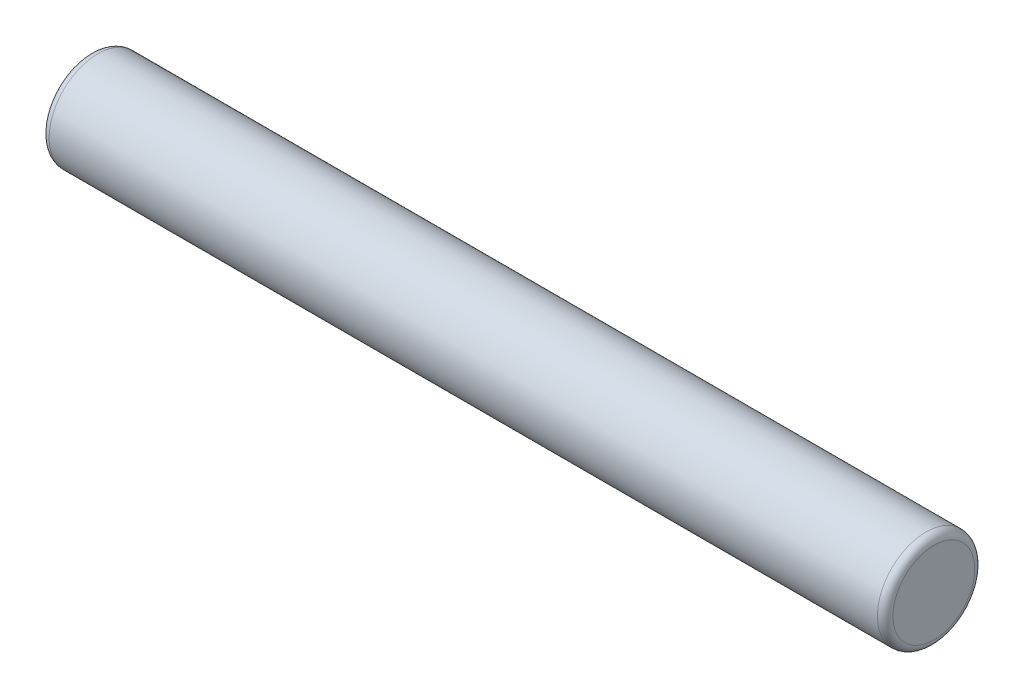
ISO-10303-21;
HEADER;
FILE_DESCRIPTION(('STEP AP214'),'2;1');
FILE_NAME('part.step','',(''),(''),'','','');
FILE_SCHEMA(('AUTOMOTIVE_DESIGN { 1 0 10303 214 1 1 1 1 }'));
ENDSEC;
DATA;
#1=APPLICATION_CONTEXT('core data for automotive mechanical design processes');
#2=APPLICATION_PROTOCOL_DEFINITION('international standard','automotive_design',2000,#1);
#3=PRODUCT_CONTEXT('',#1,'mechanical');
#4=PRODUCT('Part','Part','',(#3));
#5=PRODUCT_RELATED_PRODUCT_CATEGORY('part','',(#4));
#6=PRODUCT_DEFINITION_FORMATION('','',#4);
#7=PRODUCT_DEFINITION_CONTEXT('part definition',#1,'design');
#8=PRODUCT_DEFINITION('design','',#6,#7);
#9=PRODUCT_DEFINITION_SHAPE('','',#8);
#10=(LENGTH_UNIT() NAMED_UNIT(*) SI_UNIT(.MILLI.,.METRE.));
#11=(NAMED_UNIT(*) PLANE_ANGLE_UNIT() SI_UNIT($,.RADIAN.));
#12=(NAMED_UNIT(*) SI_UNIT($,.STERADIAN.) SOLID_ANGLE_UNIT());
#13=UNCERTAINTY_MEASURE_WITH_UNIT(LENGTH_MEASURE(1.E-05),#10,'distance_accuracy_value','');
#14=(GEOMETRIC_REPRESENTATION_CONTEXT(3) GLOBAL_UNCERTAINTY_ASSIGNED_CONTEXT((#13)) GLOBAL_UNIT_ASSIGNED_CONTEXT((#10,
#11,#12)) REPRESENTATION_CONTEXT('',''));
#15=CARTESIAN_POINT('',(0.,0.,0.));
#16=DIRECTION('',(0.,0.,1.));
#17=DIRECTION('',(1.,0.,0.));
#18=AXIS2_PLACEMENT_3D('',#15,#16,#17);
#19=CARTESIAN_POINT('',(110.,0.,0.));
#20=DIRECTION('',(-1.,0.,0.));
#21=DIRECTION('',(0.,0.,1.));
#22=AXIS2_PLACEMENT_3D('',#19,#20,#21);
#23=CYLINDRICAL_SURFACE('',#22,6.35);
#24=CARTESIAN_POINT('',(108.984,0.,0.));
#25=DIRECTION('',(1.,0.,0.));
#26=DIRECTION('',(0.,0.,-1.));
#27=AXIS2_PLACEMENT_3D('',#24,#25,#26);
#28=CIRCLE('',#27,6.35);
#29=CARTESIAN_POINT('',(108.984,0.,-6.35));
#30=VERTEX_POINT('',#29);
#31=EDGE_CURVE('E51',#30,#30,#28,.F.);
#32=ORIENTED_EDGE('',*,*,#31,.T.);
#33=EDGE_LOOP('',(#32));
#34=FACE_BOUND('',#33,.T.);
#35=CARTESIAN_POINT('',(1.016,0.,0.));
#36=DIRECTION('',(1.,0.,0.));
#37=DIRECTION('',(0.,0.,-1.));
#38=AXIS2_PLACEMENT_3D('',#35,#36,#37);
#39=CIRCLE('',#38,6.35);
#40=CARTESIAN_POINT('',(1.016,0.,-6.35));
#41=VERTEX_POINT('',#40);
#42=EDGE_CURVE('E56',#41,#41,#39,.T.);
#43=ORIENTED_EDGE('',*,*,#42,.T.);
#44=EDGE_LOOP('',(#43));
#45=FACE_BOUND('',#44,.T.);
#46=ADVANCED_FACE('F43',(#34,#45),#23,.T.);
#47=CARTESIAN_POINT('',(110.,0.,0.));
#48=DIRECTION('',(1.,0.,0.));
#49=DIRECTION('',(0.,0.,-1.));
#50=AXIS2_PLACEMENT_3D('',#47,#48,#49);
#51=PLANE('',#50);
#52=CARTESIAN_POINT('',(110.,0.,0.));
#53=DIRECTION('',(1.,0.,0.));
#54=DIRECTION('',(0.,0.,-1.));
#55=AXIS2_PLACEMENT_3D('',#52,#53,#54);
#56=CIRCLE('',#55,5.334);
#57=CARTESIAN_POINT('',(110.,0.,-5.334));
#58=VERTEX_POINT('',#57);
#59=EDGE_CURVE('E61',#58,#58,#56,.T.);
#60=ORIENTED_EDGE('',*,*,#59,.T.);
#61=EDGE_LOOP('',(#60));
#62=FACE_BOUND('',#61,.T.);
#63=ADVANCED_FACE('F68',(#62),#51,.T.);
#64=CARTESIAN_POINT('',(0.,0.,0.));
#65=DIRECTION('',(1.,0.,0.));
#66=DIRECTION('',(0.,0.,-1.));
#67=AXIS2_PLACEMENT_3D('',#64,#65,#66);
#68=PLANE('',#67);
#69=CARTESIAN_POINT('',(0.,0.,0.));
#70=DIRECTION('',(1.,0.,0.));
#71=DIRECTION('',(0.,0.,-1.));
#72=AXIS2_PLACEMENT_3D('',#69,#70,#71);
#73=CIRCLE('',#72,5.334);
#74=CARTESIAN_POINT('',(0.,0.,-5.334));
#75=VERTEX_POINT('',#74);
#76=EDGE_CURVE('E10',#75,#75,#73,.F.);
#77=ORIENTED_EDGE('',*,*,#76,.T.);
#78=EDGE_LOOP('',(#77));
#79=FACE_BOUND('',#78,.T.);
#80=ADVANCED_FACE('F72',(#79),#68,.F.);
#81=CARTESIAN_POINT('',(108.984,0.,0.));
#82=DIRECTION('',(1.,0.,0.));
#83=DIRECTION('',(0.,0.,-1.));
#84=AXIS2_PLACEMENT_3D('',#81,#82,#83);
#85=TOROIDAL_SURFACE('',#84,5.334,1.016);
#86=ORIENTED_EDGE('',*,*,#31,.F.);
#87=EDGE_LOOP('',(#86));
#88=FACE_BOUND('',#87,.T.);
#89=ORIENTED_EDGE('',*,*,#59,.F.);
#90=EDGE_LOOP('',(#89));
#91=FACE_BOUND('',#90,.T.);
#92=ADVANCED_FACE('F70',(#88,#91),#85,.T.);
#93=CARTESIAN_POINT('',(1.016,0.,0.));
#94=DIRECTION('',(1.,0.,0.));
#95=DIRECTION('',(0.,0.,-1.));
#96=AXIS2_PLACEMENT_3D('',#93,#94,#95);
#97=TOROIDAL_SURFACE('',#96,5.334,1.016);
#98=ORIENTED_EDGE('',*,*,#76,.F.);
#99=EDGE_LOOP('',(#98));
#100=FACE_BOUND('',#99,.T.);
#101=ORIENTED_EDGE('',*,*,#42,.F.);
#102=EDGE_LOOP('',(#101));
#103=FACE_BOUND('',#102,.T.);
#104=ADVANCED_FACE('F45',(#100,#103),#97,.T.);
#105=CLOSED_SHELL('',(#46,#63,#80,#92,#104));
#106=MANIFOLD_SOLID_BREP('B2',#105);
#107=ADVANCED_BREP_SHAPE_REPRESENTATION('',(#18,#106),#14);
#108=SHAPE_DEFINITION_REPRESENTATION(#9,#107);
ENDSEC;
END-ISO-10303-21;
